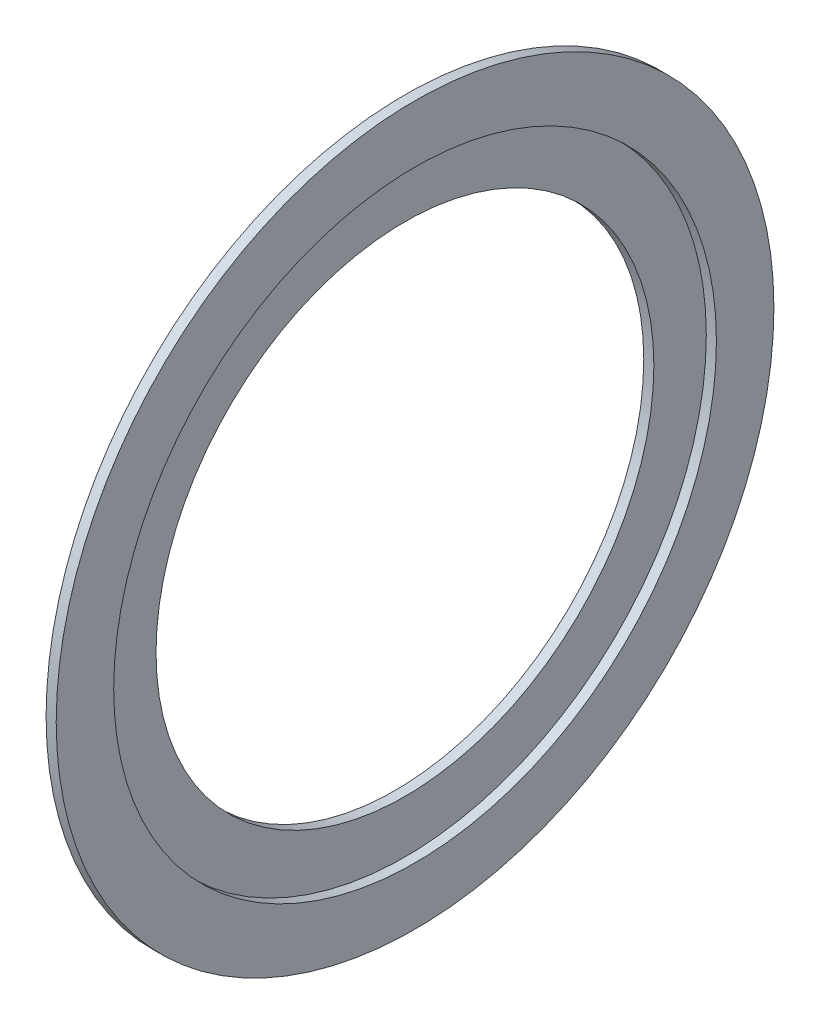
ISO-10303-21;
HEADER;
FILE_DESCRIPTION(('STEP AP214'),'2;1');
FILE_NAME('part.step','',(''),(''),'','','');
FILE_SCHEMA(('AUTOMOTIVE_DESIGN { 1 0 10303 214 1 1 1 1 }'));
ENDSEC;
DATA;
#1=APPLICATION_CONTEXT('core data for automotive mechanical design processes');
#2=APPLICATION_PROTOCOL_DEFINITION('international standard','automotive_design',2000,#1);
#3=PRODUCT_CONTEXT('',#1,'mechanical');
#4=PRODUCT('Part','Part','',(#3));
#5=PRODUCT_RELATED_PRODUCT_CATEGORY('part','',(#4));
#6=PRODUCT_DEFINITION_FORMATION('','',#4);
#7=PRODUCT_DEFINITION_CONTEXT('part definition',#1,'design');
#8=PRODUCT_DEFINITION('design','',#6,#7);
#9=PRODUCT_DEFINITION_SHAPE('','',#8);
#10=(LENGTH_UNIT() NAMED_UNIT(*) SI_UNIT(.MILLI.,.METRE.));
#11=(NAMED_UNIT(*) PLANE_ANGLE_UNIT() SI_UNIT($,.RADIAN.));
#12=(NAMED_UNIT(*) SI_UNIT($,.STERADIAN.) SOLID_ANGLE_UNIT());
#13=UNCERTAINTY_MEASURE_WITH_UNIT(LENGTH_MEASURE(1.E-05),#10,'distance_accuracy_value','');
#14=(GEOMETRIC_REPRESENTATION_CONTEXT(3) GLOBAL_UNCERTAINTY_ASSIGNED_CONTEXT((#13)) GLOBAL_UNIT_ASSIGNED_CONTEXT((#10,
#11,#12)) REPRESENTATION_CONTEXT('',''));
#15=CARTESIAN_POINT('',(0.,0.,0.));
#16=DIRECTION('',(0.,0.,1.));
#17=DIRECTION('',(1.,0.,0.));
#18=AXIS2_PLACEMENT_3D('',#15,#16,#17);
#19=CARTESIAN_POINT('',(0.304,0.,5.54375));
#20=DIRECTION('',(-1.,0.,0.));
#21=DIRECTION('',(0.,0.,1.));
#22=AXIS2_PLACEMENT_3D('',#19,#20,#21);
#23=PLANE('',#22);
#24=CARTESIAN_POINT('',(0.304,0.,0.));
#25=DIRECTION('',(-1.,0.,0.));
#26=DIRECTION('',(0.,0.,1.));
#27=AXIS2_PLACEMENT_3D('',#24,#25,#26);
#28=CIRCLE('',#27,4.925);
#29=CARTESIAN_POINT('',(0.304,0.,4.925));
#30=VERTEX_POINT('',#29);
#31=EDGE_CURVE('E18',#30,#30,#28,.F.);
#32=ORIENTED_EDGE('',*,*,#31,.T.);
#33=EDGE_LOOP('',(#32));
#34=FACE_BOUND('',#33,.T.);
#35=CARTESIAN_POINT('',(0.304,0.,0.));
#36=DIRECTION('',(-1.,0.,0.));
#37=DIRECTION('',(0.,0.,1.));
#38=AXIS2_PLACEMENT_3D('',#35,#36,#37);
#39=CIRCLE('',#38,6.1625);
#40=CARTESIAN_POINT('',(0.304,0.,6.1625));
#41=VERTEX_POINT('',#40);
#42=EDGE_CURVE('E40',#41,#41,#39,.F.);
#43=ORIENTED_EDGE('',*,*,#42,.F.);
#44=EDGE_LOOP('',(#43));
#45=FACE_BOUND('',#44,.T.);
#46=ADVANCED_FACE('F15',(#34,#45),#23,.T.);
#47=CARTESIAN_POINT('',(0.404,0.,0.));
#48=DIRECTION('',(-1.,0.,0.));
#49=DIRECTION('',(0.,0.,1.));
#50=AXIS2_PLACEMENT_3D('',#47,#48,#49);
#51=CYLINDRICAL_SURFACE('',#50,4.925);
#52=ORIENTED_EDGE('',*,*,#31,.F.);
#53=EDGE_LOOP('',(#52));
#54=FACE_BOUND('',#53,.T.);
#55=CARTESIAN_POINT('',(0.504,0.,0.));
#56=DIRECTION('',(-1.,0.,0.));
#57=DIRECTION('',(0.,0.,1.));
#58=AXIS2_PLACEMENT_3D('',#55,#56,#57);
#59=CIRCLE('',#58,4.925);
#60=CARTESIAN_POINT('',(0.504,0.,4.925));
#61=VERTEX_POINT('',#60);
#62=EDGE_CURVE('E38',#61,#61,#59,.T.);
#63=ORIENTED_EDGE('',*,*,#62,.F.);
#64=EDGE_LOOP('',(#63));
#65=FACE_BOUND('',#64,.T.);
#66=ADVANCED_FACE('F49',(#54,#65),#51,.F.);
#67=CARTESIAN_POINT('',(0.404,0.,0.));
#68=DIRECTION('',(-1.,0.,0.));
#69=DIRECTION('',(0.,0.,1.));
#70=AXIS2_PLACEMENT_3D('',#67,#68,#69);
#71=CYLINDRICAL_SURFACE('',#70,6.1625);
#72=CARTESIAN_POINT('',(0.504,0.,0.));
#73=DIRECTION('',(-1.,0.,0.));
#74=DIRECTION('',(0.,0.,1.));
#75=AXIS2_PLACEMENT_3D('',#72,#73,#74);
#76=CIRCLE('',#75,6.1625);
#77=CARTESIAN_POINT('',(0.504,0.,6.1625));
#78=VERTEX_POINT('',#77);
#79=EDGE_CURVE('E35',#78,#78,#76,.F.);
#80=ORIENTED_EDGE('',*,*,#79,.F.);
#81=EDGE_LOOP('',(#80));
#82=FACE_BOUND('',#81,.T.);
#83=ORIENTED_EDGE('',*,*,#42,.T.);
#84=EDGE_LOOP('',(#83));
#85=FACE_BOUND('',#84,.T.);
#86=ADVANCED_FACE('F52',(#82,#85),#71,.T.);
#87=CARTESIAN_POINT('',(0.504,0.,5.44375));
#88=DIRECTION('',(1.,0.,0.));
#89=DIRECTION('',(0.,0.,-1.));
#90=AXIS2_PLACEMENT_3D('',#87,#88,#89);
#91=PLANE('',#90);
#92=CARTESIAN_POINT('',(0.504,0.,0.));
#93=DIRECTION('',(-1.,0.,0.));
#94=DIRECTION('',(0.,0.,1.));
#95=AXIS2_PLACEMENT_3D('',#92,#93,#94);
#96=CIRCLE('',#95,5.9625);
#97=CARTESIAN_POINT('',(0.504,0.,5.9625));
#98=VERTEX_POINT('',#97);
#99=EDGE_CURVE('E32',#98,#98,#96,.F.);
#100=ORIENTED_EDGE('',*,*,#99,.T.);
#101=EDGE_LOOP('',(#100));
#102=FACE_BOUND('',#101,.T.);
#103=ORIENTED_EDGE('',*,*,#62,.T.);
#104=EDGE_LOOP('',(#103));
#105=FACE_BOUND('',#104,.T.);
#106=ADVANCED_FACE('F55',(#102,#105),#91,.T.);
#107=CARTESIAN_POINT('',(0.504,0.,6.63125));
#108=DIRECTION('',(-1.,0.,0.));
#109=DIRECTION('',(0.,0.,1.));
#110=AXIS2_PLACEMENT_3D('',#107,#108,#109);
#111=PLANE('',#110);
#112=ORIENTED_EDGE('',*,*,#79,.T.);
#113=EDGE_LOOP('',(#112));
#114=FACE_BOUND('',#113,.T.);
#115=CARTESIAN_POINT('',(0.504,0.,0.));
#116=DIRECTION('',(-1.,0.,0.));
#117=DIRECTION('',(0.,0.,1.));
#118=AXIS2_PLACEMENT_3D('',#115,#116,#117);
#119=CIRCLE('',#118,7.1);
#120=CARTESIAN_POINT('',(0.504,0.,7.1));
#121=VERTEX_POINT('',#120);
#122=EDGE_CURVE('E27',#121,#121,#119,.F.);
#123=ORIENTED_EDGE('',*,*,#122,.F.);
#124=EDGE_LOOP('',(#123));
#125=FACE_BOUND('',#124,.T.);
#126=ADVANCED_FACE('F57',(#114,#125),#111,.T.);
#127=CARTESIAN_POINT('',(0.604,0.,0.));
#128=DIRECTION('',(-1.,0.,0.));
#129=DIRECTION('',(0.,0.,1.));
#130=AXIS2_PLACEMENT_3D('',#127,#128,#129);
#131=CYLINDRICAL_SURFACE('',#130,5.9625);
#132=ORIENTED_EDGE('',*,*,#99,.F.);
#133=EDGE_LOOP('',(#132));
#134=FACE_BOUND('',#133,.T.);
#135=CARTESIAN_POINT('',(0.704,0.,0.));
#136=DIRECTION('',(-1.,0.,0.));
#137=DIRECTION('',(0.,0.,1.));
#138=AXIS2_PLACEMENT_3D('',#135,#136,#137);
#139=CIRCLE('',#138,5.9625);
#140=CARTESIAN_POINT('',(0.704,0.,5.9625));
#141=VERTEX_POINT('',#140);
#142=EDGE_CURVE('E22',#141,#141,#139,.T.);
#143=ORIENTED_EDGE('',*,*,#142,.F.);
#144=EDGE_LOOP('',(#143));
#145=FACE_BOUND('',#144,.T.);
#146=ADVANCED_FACE('F65',(#134,#145),#131,.F.);
#147=CARTESIAN_POINT('',(0.604,0.,0.));
#148=DIRECTION('',(-1.,0.,0.));
#149=DIRECTION('',(0.,0.,1.));
#150=AXIS2_PLACEMENT_3D('',#147,#148,#149);
#151=CYLINDRICAL_SURFACE('',#150,7.1);
#152=CARTESIAN_POINT('',(0.704,0.,0.));
#153=DIRECTION('',(-1.,0.,0.));
#154=DIRECTION('',(0.,0.,1.));
#155=AXIS2_PLACEMENT_3D('',#152,#153,#154);
#156=CIRCLE('',#155,7.1);
#157=CARTESIAN_POINT('',(0.704,0.,7.1));
#158=VERTEX_POINT('',#157);
#159=EDGE_CURVE('E10',#158,#158,#156,.F.);
#160=ORIENTED_EDGE('',*,*,#159,.F.);
#161=EDGE_LOOP('',(#160));
#162=FACE_BOUND('',#161,.T.);
#163=ORIENTED_EDGE('',*,*,#122,.T.);
#164=EDGE_LOOP('',(#163));
#165=FACE_BOUND('',#164,.T.);
#166=ADVANCED_FACE('F72',(#162,#165),#151,.T.);
#167=CARTESIAN_POINT('',(0.704,0.,6.53125));
#168=DIRECTION('',(1.,0.,0.));
#169=DIRECTION('',(0.,0.,-1.));
#170=AXIS2_PLACEMENT_3D('',#167,#168,#169);
#171=PLANE('',#170);
#172=ORIENTED_EDGE('',*,*,#159,.T.);
#173=EDGE_LOOP('',(#172));
#174=FACE_BOUND('',#173,.T.);
#175=ORIENTED_EDGE('',*,*,#142,.T.);
#176=EDGE_LOOP('',(#175));
#177=FACE_BOUND('',#176,.T.);
#178=ADVANCED_FACE('F70',(#174,#177),#171,.T.);
#179=CLOSED_SHELL('',(#46,#66,#86,#106,#126,#146,#166,#178));
#180=MANIFOLD_SOLID_BREP('B1',#179);
#181=ADVANCED_BREP_SHAPE_REPRESENTATION('',(#18,#180),#14);
#182=SHAPE_DEFINITION_REPRESENTATION(#9,#181);
ENDSEC;
END-ISO-10303-21;
